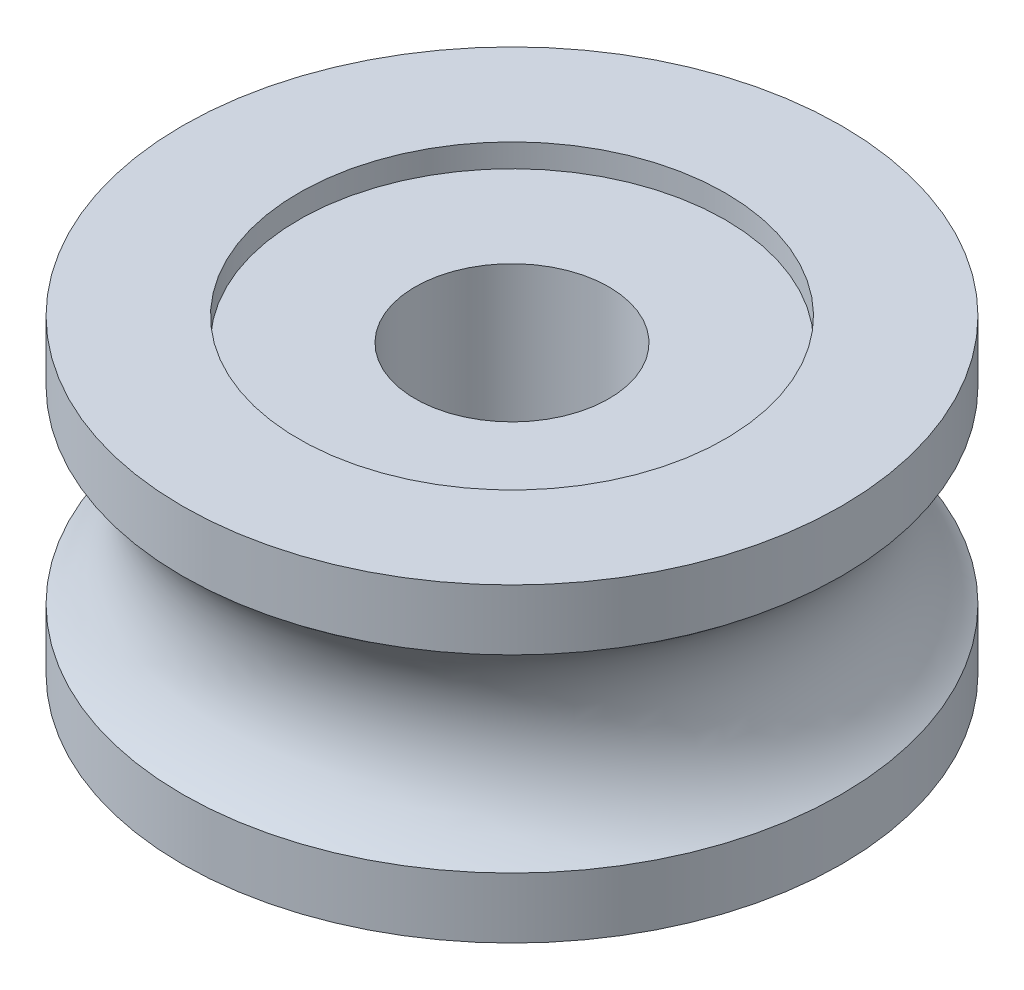
ISO-10303-21;
HEADER;
FILE_DESCRIPTION(('STEP AP214'),'2;1');
FILE_NAME('part.step','',(''),(''),'','','');
FILE_SCHEMA(('AUTOMOTIVE_DESIGN { 1 0 10303 214 1 1 1 1 }'));
ENDSEC;
DATA;
#1=APPLICATION_CONTEXT('core data for automotive mechanical design processes');
#2=APPLICATION_PROTOCOL_DEFINITION('international standard','automotive_design',2000,#1);
#3=PRODUCT_CONTEXT('',#1,'mechanical');
#4=PRODUCT('Part','Part','',(#3));
#5=PRODUCT_RELATED_PRODUCT_CATEGORY('part','',(#4));
#6=PRODUCT_DEFINITION_FORMATION('','',#4);
#7=PRODUCT_DEFINITION_CONTEXT('part definition',#1,'design');
#8=PRODUCT_DEFINITION('design','',#6,#7);
#9=PRODUCT_DEFINITION_SHAPE('','',#8);
#10=(LENGTH_UNIT() NAMED_UNIT(*) SI_UNIT(.MILLI.,.METRE.));
#11=(NAMED_UNIT(*) PLANE_ANGLE_UNIT() SI_UNIT($,.RADIAN.));
#12=(NAMED_UNIT(*) SI_UNIT($,.STERADIAN.) SOLID_ANGLE_UNIT());
#13=UNCERTAINTY_MEASURE_WITH_UNIT(LENGTH_MEASURE(1.E-05),#10,'distance_accuracy_value','');
#14=(GEOMETRIC_REPRESENTATION_CONTEXT(3) GLOBAL_UNCERTAINTY_ASSIGNED_CONTEXT((#13)) GLOBAL_UNIT_ASSIGNED_CONTEXT((#10,
#11,#12)) REPRESENTATION_CONTEXT('',''));
#15=CARTESIAN_POINT('',(0.,0.,0.));
#16=DIRECTION('',(0.,0.,1.));
#17=DIRECTION('',(1.,0.,0.));
#18=AXIS2_PLACEMENT_3D('',#15,#16,#17);
#19=CARTESIAN_POINT('',(4.3,-4.6,0.));
#20=DIRECTION('',(0.,-1.,0.));
#21=DIRECTION('',(0.,0.,-1.));
#22=AXIS2_PLACEMENT_3D('',#19,#20,#21);
#23=PLANE('',#22);
#24=CARTESIAN_POINT('',(0.,-4.6,0.));
#25=DIRECTION('',(0.,-1.,0.));
#26=DIRECTION('',(0.,0.,-1.));
#27=AXIS2_PLACEMENT_3D('',#24,#25,#26);
#28=CIRCLE('',#27,4.3);
#29=CARTESIAN_POINT('',(0.,-4.6,-4.3));
#30=VERTEX_POINT('',#29);
#31=EDGE_CURVE('E10',#30,#30,#28,.T.);
#32=ORIENTED_EDGE('',*,*,#31,.T.);
#33=EDGE_LOOP('',(#32));
#34=FACE_BOUND('',#33,.T.);
#35=CARTESIAN_POINT('',(0.,-4.6,0.));
#36=DIRECTION('',(0.,-1.,0.));
#37=DIRECTION('',(0.,0.,-1.));
#38=AXIS2_PLACEMENT_3D('',#35,#36,#37);
#39=CIRCLE('',#38,2.5);
#40=CARTESIAN_POINT('',(0.,-4.6,-2.5));
#41=VERTEX_POINT('',#40);
#42=EDGE_CURVE('E82',#41,#41,#39,.T.);
#43=ORIENTED_EDGE('',*,*,#42,.F.);
#44=EDGE_LOOP('',(#43));
#45=FACE_BOUND('',#44,.T.);
#46=ADVANCED_FACE('F39',(#34,#45),#23,.T.);
#47=CARTESIAN_POINT('',(0.,0.,0.));
#48=DIRECTION('',(0.,-1.,0.));
#49=DIRECTION('',(0.,0.,-1.));
#50=AXIS2_PLACEMENT_3D('',#47,#48,#49);
#51=CYLINDRICAL_SURFACE('',#50,4.3);
#52=CARTESIAN_POINT('',(0.,-2.8,0.));
#53=DIRECTION('',(0.,-1.,0.));
#54=DIRECTION('',(0.,0.,-1.));
#55=AXIS2_PLACEMENT_3D('',#52,#53,#54);
#56=CIRCLE('',#55,4.3);
#57=CARTESIAN_POINT('',(0.,-2.8,-4.3));
#58=VERTEX_POINT('',#57);
#59=EDGE_CURVE('E46',#58,#58,#56,.T.);
#60=ORIENTED_EDGE('',*,*,#59,.T.);
#61=EDGE_LOOP('',(#60));
#62=FACE_BOUND('',#61,.T.);
#63=ORIENTED_EDGE('',*,*,#31,.F.);
#64=EDGE_LOOP('',(#63));
#65=FACE_BOUND('',#64,.T.);
#66=ADVANCED_FACE('F91',(#62,#65),#51,.T.);
#67=CARTESIAN_POINT('',(8.5,-2.8,0.));
#68=DIRECTION('',(0.,-1.,0.));
#69=DIRECTION('',(0.,0.,-1.));
#70=AXIS2_PLACEMENT_3D('',#67,#68,#69);
#71=PLANE('',#70);
#72=CARTESIAN_POINT('',(0.,-2.8,0.));
#73=DIRECTION('',(0.,-1.,0.));
#74=DIRECTION('',(0.,0.,-1.));
#75=AXIS2_PLACEMENT_3D('',#72,#73,#74);
#76=CIRCLE('',#75,8.5);
#77=CARTESIAN_POINT('',(0.,-2.8,-8.5));
#78=VERTEX_POINT('',#77);
#79=EDGE_CURVE('E51',#78,#78,#76,.T.);
#80=ORIENTED_EDGE('',*,*,#79,.T.);
#81=EDGE_LOOP('',(#80));
#82=FACE_BOUND('',#81,.T.);
#83=ORIENTED_EDGE('',*,*,#59,.F.);
#84=EDGE_LOOP('',(#83));
#85=FACE_BOUND('',#84,.T.);
#86=ADVANCED_FACE('F95',(#82,#85),#71,.T.);
#87=CARTESIAN_POINT('',(0.,0.,0.));
#88=DIRECTION('',(0.,-1.,0.));
#89=DIRECTION('',(0.,0.,-1.));
#90=AXIS2_PLACEMENT_3D('',#87,#88,#89);
#91=CYLINDRICAL_SURFACE('',#90,8.5);
#92=CARTESIAN_POINT('',(0.,-1.23669858620224,0.));
#93=DIRECTION('',(0.,-1.,0.));
#94=DIRECTION('',(0.,0.,-1.));
#95=AXIS2_PLACEMENT_3D('',#92,#93,#94);
#96=CIRCLE('',#95,8.5);
#97=CARTESIAN_POINT('',(0.,-1.23669858620224,-8.5));
#98=VERTEX_POINT('',#97);
#99=EDGE_CURVE('E56',#98,#98,#96,.T.);
#100=ORIENTED_EDGE('',*,*,#99,.T.);
#101=EDGE_LOOP('',(#100));
#102=FACE_BOUND('',#101,.T.);
#103=ORIENTED_EDGE('',*,*,#79,.F.);
#104=EDGE_LOOP('',(#103));
#105=FACE_BOUND('',#104,.T.);
#106=ADVANCED_FACE('F99',(#102,#105),#91,.T.);
#107=CARTESIAN_POINT('',(0.,1.2,0.));
#108=DIRECTION('',(0.,-1.,0.));
#109=DIRECTION('',(0.,0.,-1.));
#110=AXIS2_PLACEMENT_3D('',#107,#108,#109);
#111=TOROIDAL_SURFACE('',#110,10.25,3.);
#112=CARTESIAN_POINT('',(0.,3.63669858620224,0.));
#113=DIRECTION('',(0.,-1.,0.));
#114=DIRECTION('',(0.,0.,-1.));
#115=AXIS2_PLACEMENT_3D('',#112,#113,#114);
#116=CIRCLE('',#115,8.5);
#117=CARTESIAN_POINT('',(0.,3.63669858620224,-8.5));
#118=VERTEX_POINT('',#117);
#119=EDGE_CURVE('E62',#118,#118,#116,.T.);
#120=ORIENTED_EDGE('',*,*,#119,.T.);
#121=EDGE_LOOP('',(#120));
#122=FACE_BOUND('',#121,.T.);
#123=ORIENTED_EDGE('',*,*,#99,.F.);
#124=EDGE_LOOP('',(#123));
#125=FACE_BOUND('',#124,.T.);
#126=ADVANCED_FACE('F106',(#122,#125),#111,.F.);
#127=CARTESIAN_POINT('',(0.,0.,0.));
#128=DIRECTION('',(0.,-1.,0.));
#129=DIRECTION('',(0.,0.,-1.));
#130=AXIS2_PLACEMENT_3D('',#127,#128,#129);
#131=CYLINDRICAL_SURFACE('',#130,8.5);
#132=CARTESIAN_POINT('',(0.,5.2,0.));
#133=DIRECTION('',(0.,-1.,0.));
#134=DIRECTION('',(0.,0.,-1.));
#135=AXIS2_PLACEMENT_3D('',#132,#133,#134);
#136=CIRCLE('',#135,8.5);
#137=CARTESIAN_POINT('',(0.,5.2,-8.5));
#138=VERTEX_POINT('',#137);
#139=EDGE_CURVE('E66',#138,#138,#136,.T.);
#140=ORIENTED_EDGE('',*,*,#139,.T.);
#141=EDGE_LOOP('',(#140));
#142=FACE_BOUND('',#141,.T.);
#143=ORIENTED_EDGE('',*,*,#119,.F.);
#144=EDGE_LOOP('',(#143));
#145=FACE_BOUND('',#144,.T.);
#146=ADVANCED_FACE('F110',(#142,#145),#131,.T.);
#147=CARTESIAN_POINT('',(8.5,5.2,0.));
#148=DIRECTION('',(0.,1.,0.));
#149=DIRECTION('',(0.,0.,1.));
#150=AXIS2_PLACEMENT_3D('',#147,#148,#149);
#151=PLANE('',#150);
#152=CARTESIAN_POINT('',(0.,5.2,0.));
#153=DIRECTION('',(0.,-1.,0.));
#154=DIRECTION('',(0.,0.,-1.));
#155=AXIS2_PLACEMENT_3D('',#152,#153,#154);
#156=CIRCLE('',#155,5.5);
#157=CARTESIAN_POINT('',(0.,5.2,-5.5));
#158=VERTEX_POINT('',#157);
#159=EDGE_CURVE('E70',#158,#158,#156,.T.);
#160=ORIENTED_EDGE('',*,*,#159,.T.);
#161=EDGE_LOOP('',(#160));
#162=FACE_BOUND('',#161,.T.);
#163=ORIENTED_EDGE('',*,*,#139,.F.);
#164=EDGE_LOOP('',(#163));
#165=FACE_BOUND('',#164,.T.);
#166=ADVANCED_FACE('F114',(#162,#165),#151,.T.);
#167=CARTESIAN_POINT('',(0.,0.,0.));
#168=DIRECTION('',(0.,-1.,0.));
#169=DIRECTION('',(0.,0.,-1.));
#170=AXIS2_PLACEMENT_3D('',#167,#168,#169);
#171=CYLINDRICAL_SURFACE('',#170,5.5);
#172=CARTESIAN_POINT('',(0.,4.6,0.));
#173=DIRECTION('',(0.,-1.,0.));
#174=DIRECTION('',(0.,0.,-1.));
#175=AXIS2_PLACEMENT_3D('',#172,#173,#174);
#176=CIRCLE('',#175,5.5);
#177=CARTESIAN_POINT('',(0.,4.6,-5.5));
#178=VERTEX_POINT('',#177);
#179=EDGE_CURVE('E74',#178,#178,#176,.T.);
#180=ORIENTED_EDGE('',*,*,#179,.T.);
#181=EDGE_LOOP('',(#180));
#182=FACE_BOUND('',#181,.T.);
#183=ORIENTED_EDGE('',*,*,#159,.F.);
#184=EDGE_LOOP('',(#183));
#185=FACE_BOUND('',#184,.T.);
#186=ADVANCED_FACE('F118',(#182,#185),#171,.F.);
#187=CARTESIAN_POINT('',(5.5,4.6,0.));
#188=DIRECTION('',(0.,1.,0.));
#189=DIRECTION('',(0.,0.,1.));
#190=AXIS2_PLACEMENT_3D('',#187,#188,#189);
#191=PLANE('',#190);
#192=CARTESIAN_POINT('',(0.,4.6,0.));
#193=DIRECTION('',(0.,-1.,0.));
#194=DIRECTION('',(0.,0.,-1.));
#195=AXIS2_PLACEMENT_3D('',#192,#193,#194);
#196=CIRCLE('',#195,2.5);
#197=CARTESIAN_POINT('',(0.,4.6,-2.5));
#198=VERTEX_POINT('',#197);
#199=EDGE_CURVE('E78',#198,#198,#196,.T.);
#200=ORIENTED_EDGE('',*,*,#199,.T.);
#201=EDGE_LOOP('',(#200));
#202=FACE_BOUND('',#201,.T.);
#203=ORIENTED_EDGE('',*,*,#179,.F.);
#204=EDGE_LOOP('',(#203));
#205=FACE_BOUND('',#204,.T.);
#206=ADVANCED_FACE('F122',(#202,#205),#191,.T.);
#207=CARTESIAN_POINT('',(0.,0.,0.));
#208=DIRECTION('',(0.,-1.,0.));
#209=DIRECTION('',(0.,0.,-1.));
#210=AXIS2_PLACEMENT_3D('',#207,#208,#209);
#211=CYLINDRICAL_SURFACE('',#210,2.5);
#212=ORIENTED_EDGE('',*,*,#42,.T.);
#213=EDGE_LOOP('',(#212));
#214=FACE_BOUND('',#213,.T.);
#215=ORIENTED_EDGE('',*,*,#199,.F.);
#216=EDGE_LOOP('',(#215));
#217=FACE_BOUND('',#216,.T.);
#218=ADVANCED_FACE('F87',(#214,#217),#211,.F.);
#219=CLOSED_SHELL('',(#46,#66,#86,#106,#126,#146,#166,#186,#206,#218));
#220=MANIFOLD_SOLID_BREP('B2',#219);
#221=ADVANCED_BREP_SHAPE_REPRESENTATION('',(#18,#220),#14);
#222=SHAPE_DEFINITION_REPRESENTATION(#9,#221);
ENDSEC;
END-ISO-10303-21;
